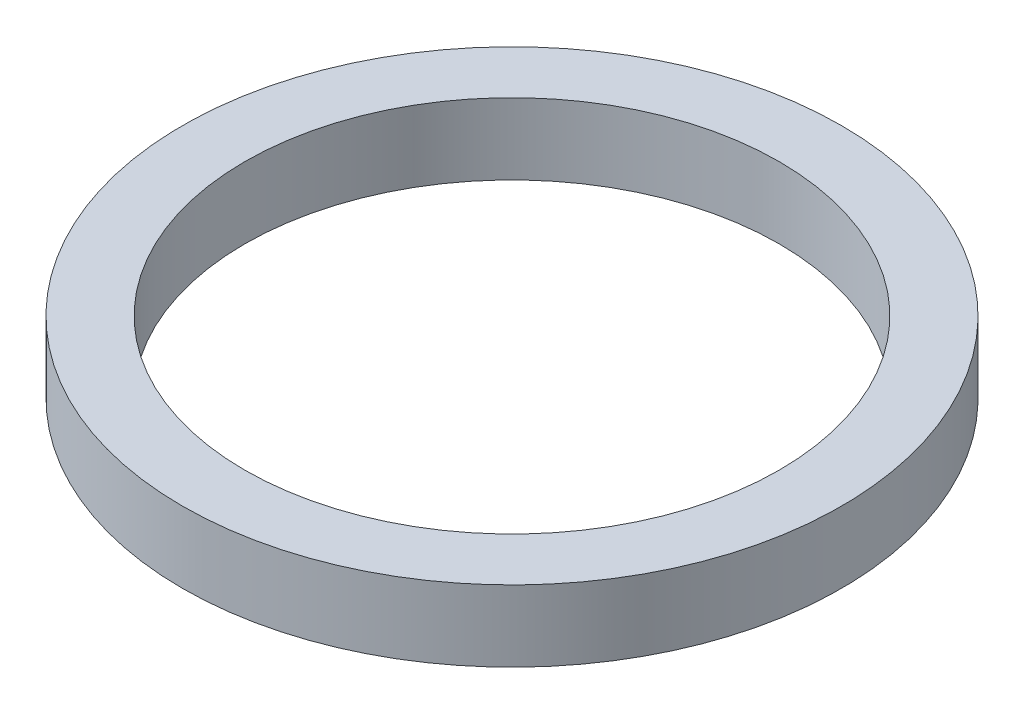
ISO-10303-21;
HEADER;
FILE_DESCRIPTION(('STEP AP214'),'2;1');
FILE_NAME('part.step','',(''),(''),'','','');
FILE_SCHEMA(('AUTOMOTIVE_DESIGN { 1 0 10303 214 1 1 1 1 }'));
ENDSEC;
DATA;
#1=APPLICATION_CONTEXT('core data for automotive mechanical design processes');
#2=APPLICATION_PROTOCOL_DEFINITION('international standard','automotive_design',2000,#1);
#3=PRODUCT_CONTEXT('',#1,'mechanical');
#4=PRODUCT('Part','Part','',(#3));
#5=PRODUCT_RELATED_PRODUCT_CATEGORY('part','',(#4));
#6=PRODUCT_DEFINITION_FORMATION('','',#4);
#7=PRODUCT_DEFINITION_CONTEXT('part definition',#1,'design');
#8=PRODUCT_DEFINITION('design','',#6,#7);
#9=PRODUCT_DEFINITION_SHAPE('','',#8);
#10=(LENGTH_UNIT() NAMED_UNIT(*) SI_UNIT(.MILLI.,.METRE.));
#11=(NAMED_UNIT(*) PLANE_ANGLE_UNIT() SI_UNIT($,.RADIAN.));
#12=(NAMED_UNIT(*) SI_UNIT($,.STERADIAN.) SOLID_ANGLE_UNIT());
#13=UNCERTAINTY_MEASURE_WITH_UNIT(LENGTH_MEASURE(1.E-05),#10,'distance_accuracy_value','');
#14=(GEOMETRIC_REPRESENTATION_CONTEXT(3) GLOBAL_UNCERTAINTY_ASSIGNED_CONTEXT((#13)) GLOBAL_UNIT_ASSIGNED_CONTEXT((#10,
#11,#12)) REPRESENTATION_CONTEXT('',''));
#15=CARTESIAN_POINT('',(0.,0.,0.));
#16=DIRECTION('',(0.,0.,1.));
#17=DIRECTION('',(1.,0.,0.));
#18=AXIS2_PLACEMENT_3D('',#15,#16,#17);
#19=CARTESIAN_POINT('',(0.,4.,0.));
#20=DIRECTION('',(0.,1.,0.));
#21=DIRECTION('',(0.,0.,1.));
#22=AXIS2_PLACEMENT_3D('',#19,#20,#21);
#23=PLANE('',#22);
#24=CARTESIAN_POINT('',(0.,4.,0.));
#25=DIRECTION('',(0.,1.,0.));
#26=DIRECTION('',(0.,0.,1.));
#27=AXIS2_PLACEMENT_3D('',#24,#25,#26);
#28=CIRCLE('',#27,18.5);
#29=CARTESIAN_POINT('',(0.,4.,18.5));
#30=VERTEX_POINT('',#29);
#31=EDGE_CURVE('E10',#30,#30,#28,.T.);
#32=ORIENTED_EDGE('',*,*,#31,.T.);
#33=EDGE_LOOP('',(#32));
#34=FACE_BOUND('',#33,.T.);
#35=CARTESIAN_POINT('',(0.,4.,0.));
#36=DIRECTION('',(0.,1.,0.));
#37=DIRECTION('',(0.,0.,1.));
#38=AXIS2_PLACEMENT_3D('',#35,#36,#37);
#39=CIRCLE('',#38,15.);
#40=CARTESIAN_POINT('',(0.,4.,15.));
#41=VERTEX_POINT('',#40);
#42=EDGE_CURVE('E48',#41,#41,#39,.T.);
#43=ORIENTED_EDGE('',*,*,#42,.F.);
#44=EDGE_LOOP('',(#43));
#45=FACE_BOUND('',#44,.T.);
#46=ADVANCED_FACE('F40',(#34,#45),#23,.T.);
#47=CARTESIAN_POINT('',(0.,0.,0.));
#48=DIRECTION('',(0.,1.,0.));
#49=DIRECTION('',(0.,0.,1.));
#50=AXIS2_PLACEMENT_3D('',#47,#48,#49);
#51=PLANE('',#50);
#52=CARTESIAN_POINT('',(0.,0.,0.));
#53=DIRECTION('',(0.,1.,0.));
#54=DIRECTION('',(0.,0.,1.));
#55=AXIS2_PLACEMENT_3D('',#52,#53,#54);
#56=CIRCLE('',#55,18.5);
#57=CARTESIAN_POINT('',(0.,0.,18.5));
#58=VERTEX_POINT('',#57);
#59=EDGE_CURVE('E41',#58,#58,#56,.T.);
#60=ORIENTED_EDGE('',*,*,#59,.F.);
#61=EDGE_LOOP('',(#60));
#62=FACE_BOUND('',#61,.T.);
#63=CARTESIAN_POINT('',(0.,0.,0.));
#64=DIRECTION('',(0.,1.,0.));
#65=DIRECTION('',(0.,0.,1.));
#66=AXIS2_PLACEMENT_3D('',#63,#64,#65);
#67=CIRCLE('',#66,15.);
#68=CARTESIAN_POINT('',(0.,0.,15.));
#69=VERTEX_POINT('',#68);
#70=EDGE_CURVE('E49',#69,#69,#67,.T.);
#71=ORIENTED_EDGE('',*,*,#70,.T.);
#72=EDGE_LOOP('',(#71));
#73=FACE_BOUND('',#72,.T.);
#74=ADVANCED_FACE('F58',(#62,#73),#51,.F.);
#75=CARTESIAN_POINT('',(0.,4.,0.));
#76=DIRECTION('',(0.,-1.,0.));
#77=DIRECTION('',(0.,0.,-1.));
#78=AXIS2_PLACEMENT_3D('',#75,#76,#77);
#79=CYLINDRICAL_SURFACE('',#78,18.5);
#80=ORIENTED_EDGE('',*,*,#31,.F.);
#81=EDGE_LOOP('',(#80));
#82=FACE_BOUND('',#81,.T.);
#83=ORIENTED_EDGE('',*,*,#59,.T.);
#84=EDGE_LOOP('',(#83));
#85=FACE_BOUND('',#84,.T.);
#86=ADVANCED_FACE('F39',(#82,#85),#79,.T.);
#87=CARTESIAN_POINT('',(0.,4.,0.));
#88=DIRECTION('',(0.,-1.,0.));
#89=DIRECTION('',(0.,0.,-1.));
#90=AXIS2_PLACEMENT_3D('',#87,#88,#89);
#91=CYLINDRICAL_SURFACE('',#90,15.);
#92=ORIENTED_EDGE('',*,*,#42,.T.);
#93=EDGE_LOOP('',(#92));
#94=FACE_BOUND('',#93,.T.);
#95=ORIENTED_EDGE('',*,*,#70,.F.);
#96=EDGE_LOOP('',(#95));
#97=FACE_BOUND('',#96,.T.);
#98=ADVANCED_FACE('F57',(#94,#97),#91,.F.);
#99=CLOSED_SHELL('',(#46,#74,#86,#98));
#100=MANIFOLD_SOLID_BREP('B2',#99);
#101=ADVANCED_BREP_SHAPE_REPRESENTATION('',(#18,#100),#14);
#102=SHAPE_DEFINITION_REPRESENTATION(#9,#101);
ENDSEC;
END-ISO-10303-21;
